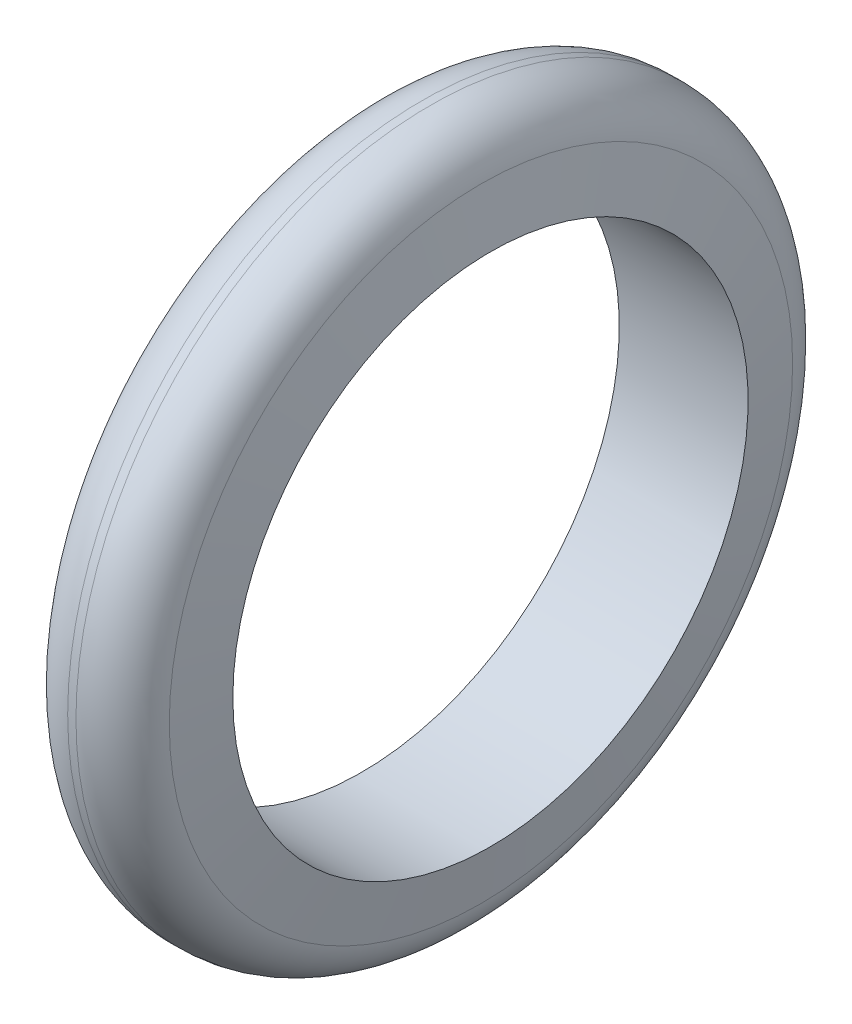
ISO-10303-21;
HEADER;
FILE_DESCRIPTION(('STEP AP214'),'2;1');
FILE_NAME('part.step','',(''),(''),'','','');
FILE_SCHEMA(('AUTOMOTIVE_DESIGN { 1 0 10303 214 1 1 1 1 }'));
ENDSEC;
DATA;
#1=APPLICATION_CONTEXT('core data for automotive mechanical design processes');
#2=APPLICATION_PROTOCOL_DEFINITION('international standard','automotive_design',2000,#1);
#3=PRODUCT_CONTEXT('',#1,'mechanical');
#4=PRODUCT('Part','Part','',(#3));
#5=PRODUCT_RELATED_PRODUCT_CATEGORY('part','',(#4));
#6=PRODUCT_DEFINITION_FORMATION('','',#4);
#7=PRODUCT_DEFINITION_CONTEXT('part definition',#1,'design');
#8=PRODUCT_DEFINITION('design','',#6,#7);
#9=PRODUCT_DEFINITION_SHAPE('','',#8);
#10=(LENGTH_UNIT() NAMED_UNIT(*) SI_UNIT(.MILLI.,.METRE.));
#11=(NAMED_UNIT(*) PLANE_ANGLE_UNIT() SI_UNIT($,.RADIAN.));
#12=(NAMED_UNIT(*) SI_UNIT($,.STERADIAN.) SOLID_ANGLE_UNIT());
#13=UNCERTAINTY_MEASURE_WITH_UNIT(LENGTH_MEASURE(1.E-05),#10,'distance_accuracy_value','');
#14=(GEOMETRIC_REPRESENTATION_CONTEXT(3) GLOBAL_UNCERTAINTY_ASSIGNED_CONTEXT((#13)) GLOBAL_UNIT_ASSIGNED_CONTEXT((#10,
#11,#12)) REPRESENTATION_CONTEXT('',''));
#15=CARTESIAN_POINT('',(0.,0.,0.));
#16=DIRECTION('',(0.,0.,1.));
#17=DIRECTION('',(1.,0.,0.));
#18=AXIS2_PLACEMENT_3D('',#15,#16,#17);
#19=CARTESIAN_POINT('',(10.,0.,0.));
#20=DIRECTION('',(-1.,0.,0.));
#21=DIRECTION('',(0.,0.,1.));
#22=AXIS2_PLACEMENT_3D('',#19,#20,#21);
#23=CONICAL_SURFACE('',#22,40.,1.39626340159547);
#24=CARTESIAN_POINT('',(8.52076026405252,0.,0.));
#25=DIRECTION('',(1.,0.,0.));
#26=DIRECTION('',(0.,0.,-1.));
#27=AXIS2_PLACEMENT_3D('',#24,#25,#26);
#28=CIRCLE('',#27,48.3891854213354);
#29=CARTESIAN_POINT('',(8.52076026405252,0.,-48.3891854213354));
#30=VERTEX_POINT('',#29);
#31=EDGE_CURVE('E37',#30,#30,#28,.T.);
#32=ORIENTED_EDGE('',*,*,#31,.T.);
#33=EDGE_LOOP('',(#32));
#34=FACE_BOUND('',#33,.T.);
#35=CARTESIAN_POINT('',(10.,0.,0.));
#36=DIRECTION('',(-1.,0.,0.));
#37=DIRECTION('',(0.,0.,1.));
#38=AXIS2_PLACEMENT_3D('',#35,#36,#37);
#39=CIRCLE('',#38,40.);
#40=CARTESIAN_POINT('',(10.,0.,40.));
#41=VERTEX_POINT('',#40);
#42=EDGE_CURVE('E53',#41,#41,#39,.T.);
#43=ORIENTED_EDGE('',*,*,#42,.T.);
#44=EDGE_LOOP('',(#43));
#45=FACE_BOUND('',#44,.T.);
#46=ADVANCED_FACE('F30',(#34,#45),#23,.T.);
#47=CARTESIAN_POINT('',(0.,0.,0.));
#48=DIRECTION('',(-1.,0.,0.));
#49=DIRECTION('',(0.,0.,1.));
#50=AXIS2_PLACEMENT_3D('',#47,#48,#49);
#51=CYLINDRICAL_SURFACE('',#50,55.);
#52=CARTESIAN_POINT('',(0.642298239954847,0.,0.));
#53=DIRECTION('',(1.,0.,0.));
#54=DIRECTION('',(0.,0.,-1.));
#55=AXIS2_PLACEMENT_3D('',#52,#53,#54);
#56=CIRCLE('',#55,55.);
#57=CARTESIAN_POINT('',(0.642298239954847,0.,-55.));
#58=VERTEX_POINT('',#57);
#59=EDGE_CURVE('E41',#58,#58,#56,.F.);
#60=ORIENTED_EDGE('',*,*,#59,.T.);
#61=EDGE_LOOP('',(#60));
#62=FACE_BOUND('',#61,.T.);
#63=CARTESIAN_POINT('',(-0.64229823995485,0.,0.));
#64=DIRECTION('',(1.,0.,0.));
#65=DIRECTION('',(0.,0.,-1.));
#66=AXIS2_PLACEMENT_3D('',#63,#64,#65);
#67=CIRCLE('',#66,55.);
#68=CARTESIAN_POINT('',(-0.64229823995485,0.,-55.));
#69=VERTEX_POINT('',#68);
#70=EDGE_CURVE('E45',#69,#69,#67,.T.);
#71=ORIENTED_EDGE('',*,*,#70,.T.);
#72=EDGE_LOOP('',(#71));
#73=FACE_BOUND('',#72,.T.);
#74=ADVANCED_FACE('F67',(#62,#73),#51,.T.);
#75=CARTESIAN_POINT('',(-7.35509528937314,0.,0.));
#76=DIRECTION('',(1.,0.,0.));
#77=DIRECTION('',(0.,0.,-1.));
#78=AXIS2_PLACEMENT_3D('',#75,#76,#77);
#79=CONICAL_SURFACE('',#78,55.,1.39626340159547);
#80=CARTESIAN_POINT('',(-8.52076026405252,0.,0.));
#81=DIRECTION('',(-1.,0.,0.));
#82=DIRECTION('',(0.,0.,1.));
#83=AXIS2_PLACEMENT_3D('',#80,#81,#82);
#84=CIRCLE('',#83,48.3891854213354);
#85=CARTESIAN_POINT('',(-8.52076026405252,0.,48.3891854213354));
#86=VERTEX_POINT('',#85);
#87=EDGE_CURVE('E10',#86,#86,#84,.T.);
#88=ORIENTED_EDGE('',*,*,#87,.T.);
#89=EDGE_LOOP('',(#88));
#90=FACE_BOUND('',#89,.T.);
#91=CARTESIAN_POINT('',(-10.,0.,0.));
#92=DIRECTION('',(-1.,0.,0.));
#93=DIRECTION('',(0.,0.,1.));
#94=AXIS2_PLACEMENT_3D('',#91,#92,#93);
#95=CIRCLE('',#94,40.);
#96=CARTESIAN_POINT('',(-10.,0.,40.));
#97=VERTEX_POINT('',#96);
#98=EDGE_CURVE('E50',#97,#97,#95,.T.);
#99=ORIENTED_EDGE('',*,*,#98,.F.);
#100=EDGE_LOOP('',(#99));
#101=FACE_BOUND('',#100,.T.);
#102=ADVANCED_FACE('F62',(#90,#101),#79,.T.);
#103=CARTESIAN_POINT('',(0.,0.,0.));
#104=DIRECTION('',(-1.,0.,0.));
#105=DIRECTION('',(0.,0.,1.));
#106=AXIS2_PLACEMENT_3D('',#103,#104,#105);
#107=CYLINDRICAL_SURFACE('',#106,40.);
#108=ORIENTED_EDGE('',*,*,#42,.F.);
#109=EDGE_LOOP('',(#108));
#110=FACE_BOUND('',#109,.T.);
#111=ORIENTED_EDGE('',*,*,#98,.T.);
#112=EDGE_LOOP('',(#111));
#113=FACE_BOUND('',#112,.T.);
#114=ADVANCED_FACE('F58',(#110,#113),#107,.F.);
#115=CARTESIAN_POINT('',(0.642298239954847,0.,0.));
#116=DIRECTION('',(1.,0.,0.));
#117=DIRECTION('',(0.,0.,-1.));
#118=AXIS2_PLACEMENT_3D('',#115,#116,#117);
#119=TOROIDAL_SURFACE('',#118,47.,8.);
#120=ORIENTED_EDGE('',*,*,#31,.F.);
#121=EDGE_LOOP('',(#120));
#122=FACE_BOUND('',#121,.T.);
#123=ORIENTED_EDGE('',*,*,#59,.F.);
#124=EDGE_LOOP('',(#123));
#125=FACE_BOUND('',#124,.T.);
#126=ADVANCED_FACE('F61',(#122,#125),#119,.T.);
#127=CARTESIAN_POINT('',(-0.64229823995485,0.,0.));
#128=DIRECTION('',(1.,0.,0.));
#129=DIRECTION('',(0.,0.,-1.));
#130=AXIS2_PLACEMENT_3D('',#127,#128,#129);
#131=TOROIDAL_SURFACE('',#130,47.,8.);
#132=ORIENTED_EDGE('',*,*,#70,.F.);
#133=EDGE_LOOP('',(#132));
#134=FACE_BOUND('',#133,.T.);
#135=ORIENTED_EDGE('',*,*,#87,.F.);
#136=EDGE_LOOP('',(#135));
#137=FACE_BOUND('',#136,.T.);
#138=ADVANCED_FACE('F32',(#134,#137),#131,.T.);
#139=CLOSED_SHELL('',(#46,#74,#102,#114,#126,#138));
#140=MANIFOLD_SOLID_BREP('B2',#139);
#141=ADVANCED_BREP_SHAPE_REPRESENTATION('',(#18,#140),#14);
#142=SHAPE_DEFINITION_REPRESENTATION(#9,#141);
ENDSEC;
END-ISO-10303-21;
